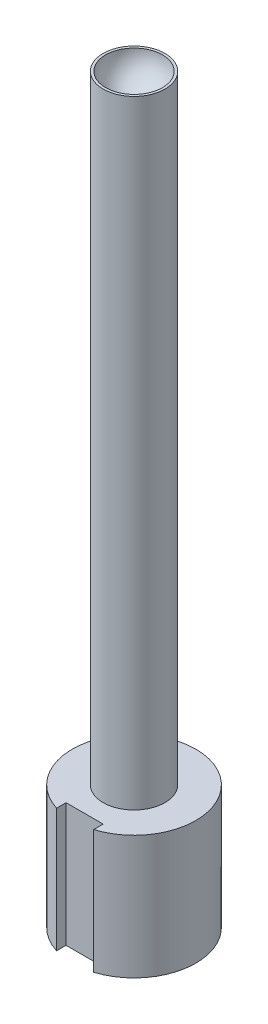
ISO-10303-21;
HEADER;
FILE_DESCRIPTION(('STEP AP214'),'2;1');
FILE_NAME('part.step','',(''),(''),'','','');
FILE_SCHEMA(('AUTOMOTIVE_DESIGN { 1 0 10303 214 1 1 1 1 }'));
ENDSEC;
DATA;
#1=APPLICATION_CONTEXT('core data for automotive mechanical design processes');
#2=APPLICATION_PROTOCOL_DEFINITION('international standard','automotive_design',2000,#1);
#3=PRODUCT_CONTEXT('',#1,'mechanical');
#4=PRODUCT('Part','Part','',(#3));
#5=PRODUCT_RELATED_PRODUCT_CATEGORY('part','',(#4));
#6=PRODUCT_DEFINITION_FORMATION('','',#4);
#7=PRODUCT_DEFINITION_CONTEXT('part definition',#1,'design');
#8=PRODUCT_DEFINITION('design','',#6,#7);
#9=PRODUCT_DEFINITION_SHAPE('','',#8);
#10=(LENGTH_UNIT() NAMED_UNIT(*) SI_UNIT(.MILLI.,.METRE.));
#11=(NAMED_UNIT(*) PLANE_ANGLE_UNIT() SI_UNIT($,.RADIAN.));
#12=(NAMED_UNIT(*) SI_UNIT($,.STERADIAN.) SOLID_ANGLE_UNIT());
#13=UNCERTAINTY_MEASURE_WITH_UNIT(LENGTH_MEASURE(1.E-05),#10,'distance_accuracy_value','');
#14=(GEOMETRIC_REPRESENTATION_CONTEXT(3) GLOBAL_UNCERTAINTY_ASSIGNED_CONTEXT((#13)) GLOBAL_UNIT_ASSIGNED_CONTEXT((#10,
#11,#12)) REPRESENTATION_CONTEXT('',''));
#15=CARTESIAN_POINT('',(0.,0.,0.));
#16=DIRECTION('',(0.,0.,1.));
#17=DIRECTION('',(1.,0.,0.));
#18=AXIS2_PLACEMENT_3D('',#15,#16,#17);
#19=CARTESIAN_POINT('',(0.,10.,0.));
#20=DIRECTION('',(0.,-1.,0.));
#21=DIRECTION('',(0.,0.,-1.));
#22=AXIS2_PLACEMENT_3D('',#19,#20,#21);
#23=CYLINDRICAL_SURFACE('',#22,5.);
#24=CARTESIAN_POINT('',(0.,0.,0.));
#25=DIRECTION('',(0.,1.,0.));
#26=DIRECTION('',(0.,0.,1.));
#27=AXIS2_PLACEMENT_3D('',#24,#25,#26);
#28=CIRCLE('',#27,5.);
#29=CARTESIAN_POINT('',(1.5,0.,4.76969600708473));
#30=VERTEX_POINT('',#29);
#31=CARTESIAN_POINT('',(-1.5,0.,4.76969600708473));
#32=VERTEX_POINT('',#31);
#33=EDGE_CURVE('E143',#30,#32,#28,.T.);
#34=ORIENTED_EDGE('',*,*,#33,.T.);
#35=DIRECTION('',(0.,-1.,0.));
#36=VECTOR('',#35,1.);
#37=CARTESIAN_POINT('',(-1.5,10.,4.76969600708473));
#38=LINE('',#37,#36);
#39=CARTESIAN_POINT('',(-1.5,10.,4.76969600708473));
#40=VERTEX_POINT('',#39);
#41=EDGE_CURVE('E132',#32,#40,#38,.F.);
#42=ORIENTED_EDGE('',*,*,#41,.T.);
#43=CARTESIAN_POINT('',(0.,10.,0.));
#44=DIRECTION('',(0.,1.,0.));
#45=DIRECTION('',(0.,0.,1.));
#46=AXIS2_PLACEMENT_3D('',#43,#44,#45);
#47=CIRCLE('',#46,5.);
#48=CARTESIAN_POINT('',(1.5,10.,4.76969600708473));
#49=VERTEX_POINT('',#48);
#50=EDGE_CURVE('E147',#49,#40,#47,.T.);
#51=ORIENTED_EDGE('',*,*,#50,.F.);
#52=DIRECTION('',(0.,-1.,0.));
#53=VECTOR('',#52,1.);
#54=CARTESIAN_POINT('',(1.5,10.,4.76969600708473));
#55=LINE('',#54,#53);
#56=EDGE_CURVE('E126',#49,#30,#55,.T.);
#57=ORIENTED_EDGE('',*,*,#56,.T.);
#58=EDGE_LOOP('',(#34,#42,#51,#57));
#59=FACE_BOUND('',#58,.T.);
#60=ADVANCED_FACE('F45',(#59),#23,.T.);
#61=CARTESIAN_POINT('',(0.,10.,0.));
#62=DIRECTION('',(0.,1.,0.));
#63=DIRECTION('',(0.,0.,1.));
#64=AXIS2_PLACEMENT_3D('',#61,#62,#63);
#65=PLANE('',#64);
#66=DIRECTION('',(0.,0.,-1.));
#67=VECTOR('',#66,1.);
#68=CARTESIAN_POINT('',(-1.5,10.,5.42089734622857));
#69=LINE('',#68,#67);
#70=CARTESIAN_POINT('',(-1.5,10.,4.));
#71=VERTEX_POINT('',#70);
#72=EDGE_CURVE('E67',#40,#71,#69,.T.);
#73=ORIENTED_EDGE('',*,*,#72,.T.);
#74=DIRECTION('',(1.,0.,0.));
#75=VECTOR('',#74,1.);
#76=CARTESIAN_POINT('',(-1.5,10.,4.));
#77=LINE('',#76,#75);
#78=CARTESIAN_POINT('',(1.5,10.,4.));
#79=VERTEX_POINT('',#78);
#80=EDGE_CURVE('E113',#71,#79,#77,.T.);
#81=ORIENTED_EDGE('',*,*,#80,.T.);
#82=DIRECTION('',(0.,0.,1.));
#83=VECTOR('',#82,1.);
#84=CARTESIAN_POINT('',(1.5,10.,5.42089734622857));
#85=LINE('',#84,#83);
#86=EDGE_CURVE('E117',#79,#49,#85,.T.);
#87=ORIENTED_EDGE('',*,*,#86,.T.);
#88=ORIENTED_EDGE('',*,*,#50,.T.);
#89=EDGE_LOOP('',(#73,#81,#87,#88));
#90=FACE_BOUND('',#89,.T.);
#91=CARTESIAN_POINT('',(0.,10.,0.));
#92=DIRECTION('',(0.,1.,0.));
#93=DIRECTION('',(0.,0.,1.));
#94=AXIS2_PLACEMENT_3D('',#91,#92,#93);
#95=CIRCLE('',#94,2.5);
#96=CARTESIAN_POINT('',(0.,10.,2.5));
#97=VERTEX_POINT('',#96);
#98=EDGE_CURVE('E53',#97,#97,#95,.T.);
#99=ORIENTED_EDGE('',*,*,#98,.F.);
#100=EDGE_LOOP('',(#99));
#101=FACE_BOUND('',#100,.T.);
#102=ADVANCED_FACE('F162',(#90,#101),#65,.T.);
#103=CARTESIAN_POINT('',(0.,0.,0.));
#104=DIRECTION('',(0.,1.,0.));
#105=DIRECTION('',(0.,0.,1.));
#106=AXIS2_PLACEMENT_3D('',#103,#104,#105);
#107=PLANE('',#106);
#108=CARTESIAN_POINT('',(0.,0.,0.));
#109=DIRECTION('',(0.,-1.,0.));
#110=DIRECTION('',(0.,0.,-1.));
#111=AXIS2_PLACEMENT_3D('',#108,#109,#110);
#112=CIRCLE('',#111,1.275);
#113=CARTESIAN_POINT('',(0.,0.,-1.275));
#114=VERTEX_POINT('',#113);
#115=EDGE_CURVE('E107',#114,#114,#112,.T.);
#116=ORIENTED_EDGE('',*,*,#115,.F.);
#117=EDGE_LOOP('',(#116));
#118=FACE_BOUND('',#117,.T.);
#119=DIRECTION('',(1.,0.,0.));
#120=VECTOR('',#119,1.);
#121=CARTESIAN_POINT('',(-1.5,0.,4.));
#122=LINE('',#121,#120);
#123=CARTESIAN_POINT('',(-1.5,0.,4.));
#124=VERTEX_POINT('',#123);
#125=CARTESIAN_POINT('',(1.5,0.,4.));
#126=VERTEX_POINT('',#125);
#127=EDGE_CURVE('E99',#124,#126,#122,.T.);
#128=ORIENTED_EDGE('',*,*,#127,.F.);
#129=DIRECTION('',(0.,0.,1.));
#130=VECTOR('',#129,1.);
#131=CARTESIAN_POINT('',(-1.5,0.,0.));
#132=LINE('',#131,#130);
#133=EDGE_CURVE('E11',#124,#32,#132,.T.);
#134=ORIENTED_EDGE('',*,*,#133,.T.);
#135=ORIENTED_EDGE('',*,*,#33,.F.);
#136=DIRECTION('',(0.,0.,1.));
#137=VECTOR('',#136,1.);
#138=CARTESIAN_POINT('',(1.5,0.,5.42089734622857));
#139=LINE('',#138,#137);
#140=EDGE_CURVE('E104',#126,#30,#139,.T.);
#141=ORIENTED_EDGE('',*,*,#140,.F.);
#142=EDGE_LOOP('',(#128,#134,#135,#141));
#143=FACE_BOUND('',#142,.T.);
#144=ADVANCED_FACE('F158',(#118,#143),#107,.F.);
#145=CARTESIAN_POINT('',(0.,60.,0.));
#146=DIRECTION('',(0.,-1.,0.));
#147=DIRECTION('',(0.,0.,-1.));
#148=AXIS2_PLACEMENT_3D('',#145,#146,#147);
#149=CYLINDRICAL_SURFACE('',#148,2.5);
#150=CARTESIAN_POINT('',(0.,60.,0.));
#151=DIRECTION('',(0.,1.,0.));
#152=DIRECTION('',(0.,0.,1.));
#153=AXIS2_PLACEMENT_3D('',#150,#151,#152);
#154=CIRCLE('',#153,2.5);
#155=CARTESIAN_POINT('',(0.,60.,2.5));
#156=VERTEX_POINT('',#155);
#157=EDGE_CURVE('E139',#156,#156,#154,.T.);
#158=ORIENTED_EDGE('',*,*,#157,.F.);
#159=EDGE_LOOP('',(#158));
#160=FACE_BOUND('',#159,.T.);
#161=ORIENTED_EDGE('',*,*,#98,.T.);
#162=EDGE_LOOP('',(#161));
#163=FACE_BOUND('',#162,.T.);
#164=ADVANCED_FACE('F183',(#160,#163),#149,.T.);
#165=CARTESIAN_POINT('',(0.,60.,0.));
#166=DIRECTION('',(0.,1.,0.));
#167=DIRECTION('',(0.,0.,1.));
#168=AXIS2_PLACEMENT_3D('',#165,#166,#167);
#169=PLANE('',#168);
#170=CARTESIAN_POINT('',(0.,60.,0.));
#171=DIRECTION('',(0.,1.,0.));
#172=DIRECTION('',(-1.,0.,0.));
#173=AXIS2_PLACEMENT_3D('',#170,#171,#172);
#174=CIRCLE('',#173,2.3);
#175=CARTESIAN_POINT('',(-2.3,60.,0.));
#176=VERTEX_POINT('',#175);
#177=EDGE_CURVE('E135',#176,#176,#174,.T.);
#178=ORIENTED_EDGE('',*,*,#177,.F.);
#179=EDGE_LOOP('',(#178));
#180=FACE_BOUND('',#179,.T.);
#181=ORIENTED_EDGE('',*,*,#157,.T.);
#182=EDGE_LOOP('',(#181));
#183=FACE_BOUND('',#182,.T.);
#184=ADVANCED_FACE('F188',(#180,#183),#169,.T.);
#185=CARTESIAN_POINT('',(0.,60.,0.));
#186=DIRECTION('',(0.,1.,0.));
#187=DIRECTION('',(1.,0.,0.));
#188=AXIS2_PLACEMENT_3D('',#185,#186,#187);
#189=SPHERICAL_SURFACE('',#188,2.3);
#190=ORIENTED_EDGE('',*,*,#177,.T.);
#191=EDGE_LOOP('',(#190));
#192=FACE_BOUND('',#191,.T.);
#193=ADVANCED_FACE('F173',(#192),#189,.F.);
#194=CARTESIAN_POINT('',(-1.5,10.,5.42089734622857));
#195=DIRECTION('',(-1.,0.,0.));
#196=DIRECTION('',(0.,0.,1.));
#197=AXIS2_PLACEMENT_3D('',#194,#195,#196);
#198=PLANE('',#197);
#199=ORIENTED_EDGE('',*,*,#133,.F.);
#200=DIRECTION('',(0.,-1.,0.));
#201=VECTOR('',#200,1.);
#202=CARTESIAN_POINT('',(-1.5,10.,4.));
#203=LINE('',#202,#201);
#204=EDGE_CURVE('E60',#71,#124,#203,.T.);
#205=ORIENTED_EDGE('',*,*,#204,.F.);
#206=ORIENTED_EDGE('',*,*,#72,.F.);
#207=ORIENTED_EDGE('',*,*,#41,.F.);
#208=EDGE_LOOP('',(#199,#205,#206,#207));
#209=FACE_BOUND('',#208,.T.);
#210=ADVANCED_FACE('F159',(#209),#198,.F.);
#211=CARTESIAN_POINT('',(1.5,10.,5.42089734622857));
#212=DIRECTION('',(1.,0.,0.));
#213=DIRECTION('',(0.,0.,-1.));
#214=AXIS2_PLACEMENT_3D('',#211,#212,#213);
#215=PLANE('',#214);
#216=ORIENTED_EDGE('',*,*,#86,.F.);
#217=DIRECTION('',(0.,-1.,0.));
#218=VECTOR('',#217,1.);
#219=CARTESIAN_POINT('',(1.5,10.,4.));
#220=LINE('',#219,#218);
#221=EDGE_CURVE('E123',#79,#126,#220,.T.);
#222=ORIENTED_EDGE('',*,*,#221,.T.);
#223=ORIENTED_EDGE('',*,*,#140,.T.);
#224=ORIENTED_EDGE('',*,*,#56,.F.);
#225=EDGE_LOOP('',(#216,#222,#223,#224));
#226=FACE_BOUND('',#225,.T.);
#227=ADVANCED_FACE('F165',(#226),#215,.F.);
#228=CARTESIAN_POINT('',(-1.5,10.,4.));
#229=DIRECTION('',(0.,0.,-1.));
#230=DIRECTION('',(-1.,0.,0.));
#231=AXIS2_PLACEMENT_3D('',#228,#229,#230);
#232=PLANE('',#231);
#233=ORIENTED_EDGE('',*,*,#127,.T.);
#234=ORIENTED_EDGE('',*,*,#221,.F.);
#235=ORIENTED_EDGE('',*,*,#80,.F.);
#236=ORIENTED_EDGE('',*,*,#204,.T.);
#237=EDGE_LOOP('',(#233,#234,#235,#236));
#238=FACE_BOUND('',#237,.T.);
#239=ADVANCED_FACE('F92',(#238),#232,.F.);
#240=CARTESIAN_POINT('',(0.,5.,0.));
#241=DIRECTION('',(0.,-1.,0.));
#242=DIRECTION('',(0.,0.,-1.));
#243=AXIS2_PLACEMENT_3D('',#240,#241,#242);
#244=CONICAL_SURFACE('',#243,1.25,1.02974425867665);
#245=CARTESIAN_POINT('',(0.,5.75107577378445,0.));
#246=VERTEX_POINT('',#245);
#247=VERTEX_LOOP('',#246);
#248=FACE_BOUND('',#247,.T.);
#249=CARTESIAN_POINT('',(0.,5.,0.));
#250=DIRECTION('',(0.,-1.,0.));
#251=DIRECTION('',(0.,0.,-1.));
#252=AXIS2_PLACEMENT_3D('',#249,#250,#251);
#253=CIRCLE('',#252,1.25);
#254=CARTESIAN_POINT('',(0.,5.,-1.25));
#255=VERTEX_POINT('',#254);
#256=EDGE_CURVE('E96',#255,#255,#253,.T.);
#257=ORIENTED_EDGE('',*,*,#256,.T.);
#258=EDGE_LOOP('',(#257));
#259=FACE_BOUND('',#258,.T.);
#260=ADVANCED_FACE('F88',(#248,#259),#244,.F.);
#261=CARTESIAN_POINT('',(0.,0.,0.));
#262=DIRECTION('',(0.,-1.,0.));
#263=DIRECTION('',(0.,0.,-1.));
#264=AXIS2_PLACEMENT_3D('',#261,#262,#263);
#265=CYLINDRICAL_SURFACE('',#264,1.25);
#266=ORIENTED_EDGE('',*,*,#256,.F.);
#267=EDGE_LOOP('',(#266));
#268=FACE_BOUND('',#267,.T.);
#269=CARTESIAN_POINT('',(0.,0.0249999999999998,0.));
#270=DIRECTION('',(0.,-1.,0.));
#271=DIRECTION('',(0.,0.,-1.));
#272=AXIS2_PLACEMENT_3D('',#269,#270,#271);
#273=CIRCLE('',#272,1.25);
#274=CARTESIAN_POINT('',(0.,0.0249999999999998,-1.25));
#275=VERTEX_POINT('',#274);
#276=EDGE_CURVE('E100',#275,#275,#273,.T.);
#277=ORIENTED_EDGE('',*,*,#276,.T.);
#278=EDGE_LOOP('',(#277));
#279=FACE_BOUND('',#278,.T.);
#280=ADVANCED_FACE('F91',(#268,#279),#265,.F.);
#281=CARTESIAN_POINT('',(0.,0.,0.));
#282=DIRECTION('',(0.,-1.,0.));
#283=DIRECTION('',(0.,0.,-1.));
#284=AXIS2_PLACEMENT_3D('',#281,#282,#283);
#285=CONICAL_SURFACE('',#284,1.275,0.785398163397461);
#286=ORIENTED_EDGE('',*,*,#276,.F.);
#287=EDGE_LOOP('',(#286));
#288=FACE_BOUND('',#287,.T.);
#289=ORIENTED_EDGE('',*,*,#115,.T.);
#290=EDGE_LOOP('',(#289));
#291=FACE_BOUND('',#290,.T.);
#292=ADVANCED_FACE('F235',(#288,#291),#285,.F.);
#293=CLOSED_SHELL('',(#60,#102,#144,#164,#184,#193,#210,#227,#239,#260,#280,#292));
#294=MANIFOLD_SOLID_BREP('B2',#293);
#295=ADVANCED_BREP_SHAPE_REPRESENTATION('',(#18,#294),#14);
#296=SHAPE_DEFINITION_REPRESENTATION(#9,#295);
ENDSEC;
END-ISO-10303-21;
